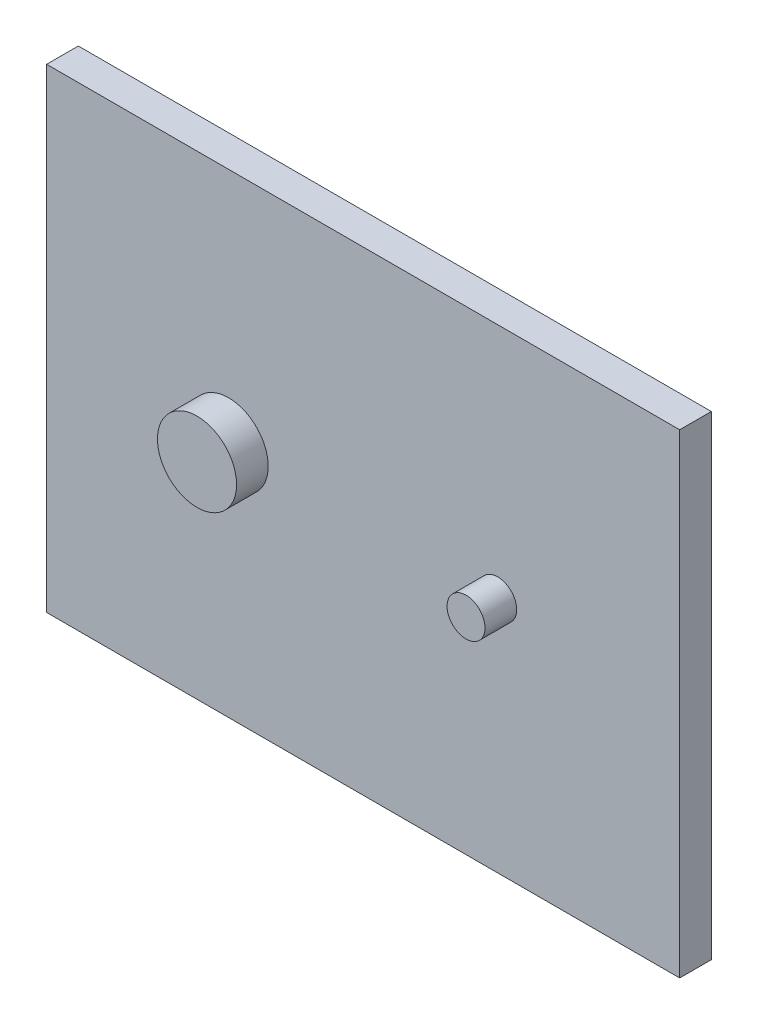
ISO-10303-21;
HEADER;
FILE_DESCRIPTION(('STEP AP214'),'2;1');
FILE_NAME('part.step','',(''),(''),'','','');
FILE_SCHEMA(('AUTOMOTIVE_DESIGN { 1 0 10303 214 1 1 1 1 }'));
ENDSEC;
DATA;
#1=APPLICATION_CONTEXT('core data for automotive mechanical design processes');
#2=APPLICATION_PROTOCOL_DEFINITION('international standard','automotive_design',2000,#1);
#3=PRODUCT_CONTEXT('',#1,'mechanical');
#4=PRODUCT('Part','Part','',(#3));
#5=PRODUCT_RELATED_PRODUCT_CATEGORY('part','',(#4));
#6=PRODUCT_DEFINITION_FORMATION('','',#4);
#7=PRODUCT_DEFINITION_CONTEXT('part definition',#1,'design');
#8=PRODUCT_DEFINITION('design','',#6,#7);
#9=PRODUCT_DEFINITION_SHAPE('','',#8);
#10=(LENGTH_UNIT() NAMED_UNIT(*) SI_UNIT(.MILLI.,.METRE.));
#11=(NAMED_UNIT(*) PLANE_ANGLE_UNIT() SI_UNIT($,.RADIAN.));
#12=(NAMED_UNIT(*) SI_UNIT($,.STERADIAN.) SOLID_ANGLE_UNIT());
#13=UNCERTAINTY_MEASURE_WITH_UNIT(LENGTH_MEASURE(1.E-05),#10,'distance_accuracy_value','');
#14=(GEOMETRIC_REPRESENTATION_CONTEXT(3) GLOBAL_UNCERTAINTY_ASSIGNED_CONTEXT((#13)) GLOBAL_UNIT_ASSIGNED_CONTEXT((#10,
#11,#12)) REPRESENTATION_CONTEXT('',''));
#15=CARTESIAN_POINT('',(0.,0.,0.));
#16=DIRECTION('',(0.,0.,1.));
#17=DIRECTION('',(1.,0.,0.));
#18=AXIS2_PLACEMENT_3D('',#15,#16,#17);
#19=CARTESIAN_POINT('',(-127.921269035533,-106.272030456853,10.));
#20=DIRECTION('',(0.,0.,1.));
#21=DIRECTION('',(1.,0.,0.));
#22=AXIS2_PLACEMENT_3D('',#19,#20,#21);
#23=PLANE('',#22);
#24=CARTESIAN_POINT('',(-70.421269035533,-31.2720304568528,10.));
#25=DIRECTION('',(0.,0.,1.));
#26=DIRECTION('',(1.,0.,0.));
#27=AXIS2_PLACEMENT_3D('',#24,#25,#26);
#28=CIRCLE('',#27,12.5);
#29=CARTESIAN_POINT('',(-57.921269035533,-31.2720304568528,10.));
#30=VERTEX_POINT('',#29);
#31=EDGE_CURVE('E113',#30,#30,#28,.T.);
#32=ORIENTED_EDGE('',*,*,#31,.F.);
#33=EDGE_LOOP('',(#32));
#34=FACE_BOUND('',#33,.T.);
#35=DIRECTION('',(0.,-1.,0.));
#36=VECTOR('',#35,1.);
#37=CARTESIAN_POINT('',(-127.921269035533,43.7279695431472,10.));
#38=LINE('',#37,#36);
#39=CARTESIAN_POINT('',(-127.921269035533,43.7279695431472,10.));
#40=VERTEX_POINT('',#39);
#41=CARTESIAN_POINT('',(-127.921269035533,-106.272030456853,10.));
#42=VERTEX_POINT('',#41);
#43=EDGE_CURVE('E87',#40,#42,#38,.T.);
#44=ORIENTED_EDGE('',*,*,#43,.T.);
#45=DIRECTION('',(1.,0.,0.));
#46=VECTOR('',#45,1.);
#47=CARTESIAN_POINT('',(-127.921269035533,-106.272030456853,10.));
#48=LINE('',#47,#46);
#49=CARTESIAN_POINT('',(72.078730964467,-106.272030456853,10.));
#50=VERTEX_POINT('',#49);
#51=EDGE_CURVE('E82',#42,#50,#48,.T.);
#52=ORIENTED_EDGE('',*,*,#51,.T.);
#53=DIRECTION('',(0.,1.,0.));
#54=VECTOR('',#53,1.);
#55=CARTESIAN_POINT('',(72.078730964467,43.7279695431472,10.));
#56=LINE('',#55,#54);
#57=CARTESIAN_POINT('',(72.078730964467,43.7279695431472,10.));
#58=VERTEX_POINT('',#57);
#59=EDGE_CURVE('E85',#50,#58,#56,.T.);
#60=ORIENTED_EDGE('',*,*,#59,.T.);
#61=DIRECTION('',(-1.,0.,0.));
#62=VECTOR('',#61,1.);
#63=CARTESIAN_POINT('',(-127.921269035533,43.7279695431472,10.));
#64=LINE('',#63,#62);
#65=EDGE_CURVE('E52',#58,#40,#64,.T.);
#66=ORIENTED_EDGE('',*,*,#65,.T.);
#67=EDGE_LOOP('',(#44,#52,#60,#66));
#68=FACE_BOUND('',#67,.T.);
#69=CARTESIAN_POINT('',(14.578730964467,-31.2720304568528,10.));
#70=DIRECTION('',(0.,0.,1.));
#71=DIRECTION('',(1.,0.,0.));
#72=AXIS2_PLACEMENT_3D('',#69,#70,#71);
#73=CIRCLE('',#72,6.00000000000001);
#74=CARTESIAN_POINT('',(20.578730964467,-31.2720304568528,10.));
#75=VERTEX_POINT('',#74);
#76=EDGE_CURVE('E119',#75,#75,#73,.T.);
#77=ORIENTED_EDGE('',*,*,#76,.F.);
#78=EDGE_LOOP('',(#77));
#79=FACE_BOUND('',#78,.T.);
#80=ADVANCED_FACE('F35',(#34,#68,#79),#23,.T.);
#81=CARTESIAN_POINT('',(-127.921269035533,43.7279695431472,10.));
#82=DIRECTION('',(1.,0.,0.));
#83=DIRECTION('',(0.,1.,0.));
#84=AXIS2_PLACEMENT_3D('',#81,#82,#83);
#85=PLANE('',#84);
#86=DIRECTION('',(0.,-1.,0.));
#87=VECTOR('',#86,1.);
#88=CARTESIAN_POINT('',(-127.921269035533,43.7279695431472,0.));
#89=LINE('',#88,#87);
#90=CARTESIAN_POINT('',(-127.921269035533,43.7279695431472,0.));
#91=VERTEX_POINT('',#90);
#92=CARTESIAN_POINT('',(-127.921269035533,-106.272030456853,0.));
#93=VERTEX_POINT('',#92);
#94=EDGE_CURVE('E99',#91,#93,#89,.T.);
#95=ORIENTED_EDGE('',*,*,#94,.T.);
#96=DIRECTION('',(0.,0.,-1.));
#97=VECTOR('',#96,1.);
#98=CARTESIAN_POINT('',(-127.921269035533,-106.272030456853,10.));
#99=LINE('',#98,#97);
#100=EDGE_CURVE('E11',#42,#93,#99,.T.);
#101=ORIENTED_EDGE('',*,*,#100,.F.);
#102=ORIENTED_EDGE('',*,*,#43,.F.);
#103=DIRECTION('',(0.,0.,-1.));
#104=VECTOR('',#103,1.);
#105=CARTESIAN_POINT('',(-127.921269035533,43.7279695431472,10.));
#106=LINE('',#105,#104);
#107=EDGE_CURVE('E95',#40,#91,#106,.T.);
#108=ORIENTED_EDGE('',*,*,#107,.T.);
#109=EDGE_LOOP('',(#95,#101,#102,#108));
#110=FACE_BOUND('',#109,.T.);
#111=ADVANCED_FACE('F37',(#110),#85,.F.);
#112=CARTESIAN_POINT('',(-127.921269035533,-106.272030456853,10.));
#113=DIRECTION('',(0.,1.,0.));
#114=DIRECTION('',(0.,0.,1.));
#115=AXIS2_PLACEMENT_3D('',#112,#113,#114);
#116=PLANE('',#115);
#117=DIRECTION('',(1.,0.,0.));
#118=VECTOR('',#117,1.);
#119=CARTESIAN_POINT('',(-127.921269035533,-106.272030456853,0.));
#120=LINE('',#119,#118);
#121=CARTESIAN_POINT('',(72.078730964467,-106.272030456853,0.));
#122=VERTEX_POINT('',#121);
#123=EDGE_CURVE('E91',#93,#122,#120,.T.);
#124=ORIENTED_EDGE('',*,*,#123,.T.);
#125=DIRECTION('',(0.,0.,-1.));
#126=VECTOR('',#125,1.);
#127=CARTESIAN_POINT('',(72.078730964467,-106.272030456853,10.));
#128=LINE('',#127,#126);
#129=EDGE_CURVE('E44',#50,#122,#128,.T.);
#130=ORIENTED_EDGE('',*,*,#129,.F.);
#131=ORIENTED_EDGE('',*,*,#51,.F.);
#132=ORIENTED_EDGE('',*,*,#100,.T.);
#133=EDGE_LOOP('',(#124,#130,#131,#132));
#134=FACE_BOUND('',#133,.T.);
#135=ADVANCED_FACE('F90',(#134),#116,.F.);
#136=CARTESIAN_POINT('',(72.078730964467,43.7279695431472,10.));
#137=DIRECTION('',(-1.,0.,0.));
#138=DIRECTION('',(0.,0.,1.));
#139=AXIS2_PLACEMENT_3D('',#136,#137,#138);
#140=PLANE('',#139);
#141=DIRECTION('',(0.,1.,0.));
#142=VECTOR('',#141,1.);
#143=CARTESIAN_POINT('',(72.078730964467,43.7279695431472,0.));
#144=LINE('',#143,#142);
#145=CARTESIAN_POINT('',(72.078730964467,43.7279695431472,0.));
#146=VERTEX_POINT('',#145);
#147=EDGE_CURVE('E69',#122,#146,#144,.T.);
#148=ORIENTED_EDGE('',*,*,#147,.T.);
#149=DIRECTION('',(0.,0.,-1.));
#150=VECTOR('',#149,1.);
#151=CARTESIAN_POINT('',(72.078730964467,43.7279695431472,10.));
#152=LINE('',#151,#150);
#153=EDGE_CURVE('E92',#58,#146,#152,.T.);
#154=ORIENTED_EDGE('',*,*,#153,.F.);
#155=ORIENTED_EDGE('',*,*,#59,.F.);
#156=ORIENTED_EDGE('',*,*,#129,.T.);
#157=EDGE_LOOP('',(#148,#154,#155,#156));
#158=FACE_BOUND('',#157,.T.);
#159=ADVANCED_FACE('F93',(#158),#140,.F.);
#160=CARTESIAN_POINT('',(-127.921269035533,43.7279695431472,10.));
#161=DIRECTION('',(0.,-1.,0.));
#162=DIRECTION('',(0.,0.,-1.));
#163=AXIS2_PLACEMENT_3D('',#160,#161,#162);
#164=PLANE('',#163);
#165=DIRECTION('',(-1.,0.,0.));
#166=VECTOR('',#165,1.);
#167=CARTESIAN_POINT('',(-127.921269035533,43.7279695431472,0.));
#168=LINE('',#167,#166);
#169=EDGE_CURVE('E75',#146,#91,#168,.T.);
#170=ORIENTED_EDGE('',*,*,#169,.T.);
#171=ORIENTED_EDGE('',*,*,#107,.F.);
#172=ORIENTED_EDGE('',*,*,#65,.F.);
#173=ORIENTED_EDGE('',*,*,#153,.T.);
#174=EDGE_LOOP('',(#170,#171,#172,#173));
#175=FACE_BOUND('',#174,.T.);
#176=ADVANCED_FACE('F107',(#175),#164,.F.);
#177=CARTESIAN_POINT('',(-127.921269035533,-106.272030456853,0.));
#178=DIRECTION('',(0.,0.,1.));
#179=DIRECTION('',(1.,0.,0.));
#180=AXIS2_PLACEMENT_3D('',#177,#178,#179);
#181=PLANE('',#180);
#182=ORIENTED_EDGE('',*,*,#94,.F.);
#183=ORIENTED_EDGE('',*,*,#169,.F.);
#184=ORIENTED_EDGE('',*,*,#147,.F.);
#185=ORIENTED_EDGE('',*,*,#123,.F.);
#186=EDGE_LOOP('',(#182,#183,#184,#185));
#187=FACE_BOUND('',#186,.T.);
#188=ADVANCED_FACE('F110',(#187),#181,.F.);
#189=CARTESIAN_POINT('',(-70.421269035533,-31.2720304568528,20.));
#190=DIRECTION('',(0.,0.,-1.));
#191=DIRECTION('',(-1.,0.,0.));
#192=AXIS2_PLACEMENT_3D('',#189,#190,#191);
#193=CYLINDRICAL_SURFACE('',#192,12.5);
#194=CARTESIAN_POINT('',(-70.421269035533,-31.2720304568528,20.));
#195=DIRECTION('',(0.,0.,1.));
#196=DIRECTION('',(1.,0.,0.));
#197=AXIS2_PLACEMENT_3D('',#194,#195,#196);
#198=CIRCLE('',#197,12.5);
#199=CARTESIAN_POINT('',(-57.921269035533,-31.2720304568528,20.));
#200=VERTEX_POINT('',#199);
#201=EDGE_CURVE('E102',#200,#200,#198,.T.);
#202=ORIENTED_EDGE('',*,*,#201,.F.);
#203=EDGE_LOOP('',(#202));
#204=FACE_BOUND('',#203,.T.);
#205=ORIENTED_EDGE('',*,*,#31,.T.);
#206=EDGE_LOOP('',(#205));
#207=FACE_BOUND('',#206,.T.);
#208=ADVANCED_FACE('F142',(#204,#207),#193,.T.);
#209=CARTESIAN_POINT('',(-70.421269035533,-31.2720304568528,20.));
#210=DIRECTION('',(0.,0.,1.));
#211=DIRECTION('',(1.,0.,0.));
#212=AXIS2_PLACEMENT_3D('',#209,#210,#211);
#213=PLANE('',#212);
#214=ORIENTED_EDGE('',*,*,#201,.T.);
#215=EDGE_LOOP('',(#214));
#216=FACE_BOUND('',#215,.T.);
#217=ADVANCED_FACE('F130',(#216),#213,.T.);
#218=CARTESIAN_POINT('',(14.578730964467,-31.2720304568528,20.));
#219=DIRECTION('',(0.,0.,-1.));
#220=DIRECTION('',(-1.,0.,0.));
#221=AXIS2_PLACEMENT_3D('',#218,#219,#220);
#222=CYLINDRICAL_SURFACE('',#221,6.00000000000001);
#223=CARTESIAN_POINT('',(14.578730964467,-31.2720304568528,20.));
#224=DIRECTION('',(0.,0.,1.));
#225=DIRECTION('',(1.,0.,0.));
#226=AXIS2_PLACEMENT_3D('',#223,#224,#225);
#227=CIRCLE('',#226,6.00000000000001);
#228=CARTESIAN_POINT('',(20.578730964467,-31.2720304568528,20.));
#229=VERTEX_POINT('',#228);
#230=EDGE_CURVE('E116',#229,#229,#227,.T.);
#231=ORIENTED_EDGE('',*,*,#230,.F.);
#232=EDGE_LOOP('',(#231));
#233=FACE_BOUND('',#232,.T.);
#234=ORIENTED_EDGE('',*,*,#76,.T.);
#235=EDGE_LOOP('',(#234));
#236=FACE_BOUND('',#235,.T.);
#237=ADVANCED_FACE('F127',(#233,#236),#222,.T.);
#238=CARTESIAN_POINT('',(14.578730964467,-31.2720304568528,20.));
#239=DIRECTION('',(0.,0.,1.));
#240=DIRECTION('',(1.,0.,0.));
#241=AXIS2_PLACEMENT_3D('',#238,#239,#240);
#242=PLANE('',#241);
#243=ORIENTED_EDGE('',*,*,#230,.T.);
#244=EDGE_LOOP('',(#243));
#245=FACE_BOUND('',#244,.T.);
#246=ADVANCED_FACE('F125',(#245),#242,.T.);
#247=CLOSED_SHELL('',(#80,#111,#135,#159,#176,#188,#208,#217,#237,#246));
#248=MANIFOLD_SOLID_BREP('B2',#247);
#249=ADVANCED_BREP_SHAPE_REPRESENTATION('',(#18,#248),#14);
#250=SHAPE_DEFINITION_REPRESENTATION(#9,#249);
ENDSEC;
END-ISO-10303-21;
